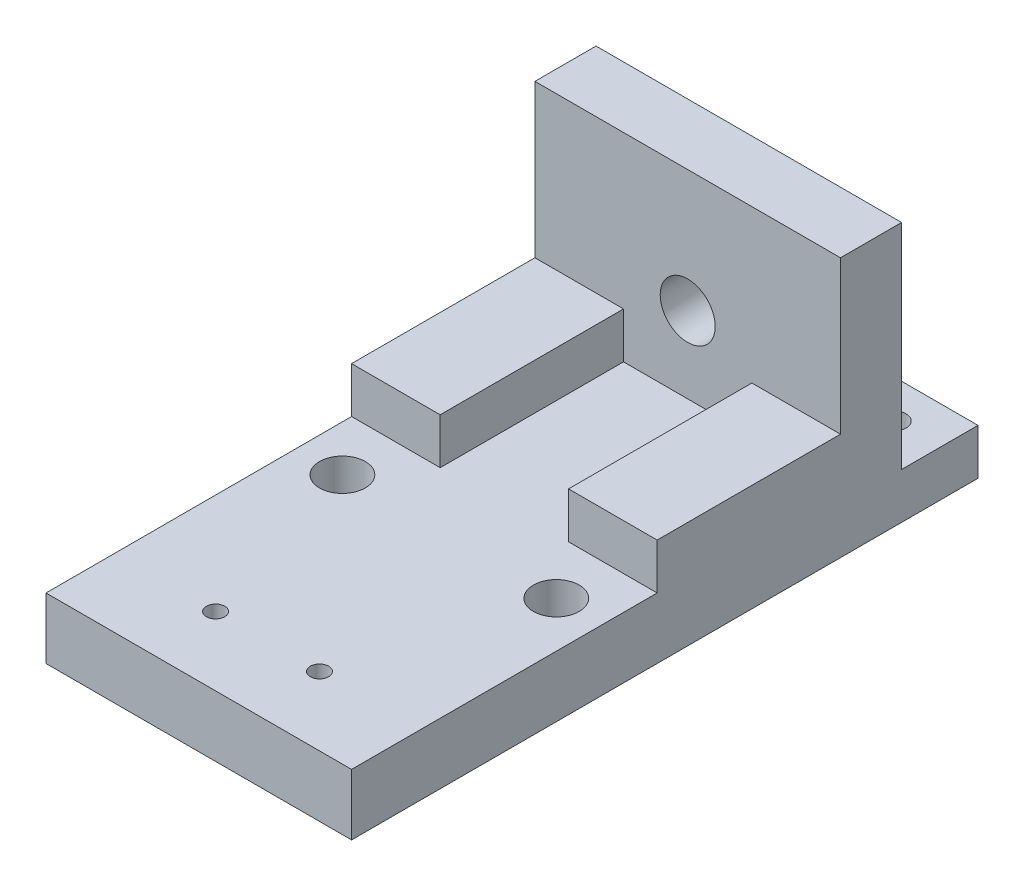
ISO-10303-21;
HEADER;
FILE_DESCRIPTION(('STEP AP214'),'2;1');
FILE_NAME('part.step','',(''),(''),'','','');
FILE_SCHEMA(('AUTOMOTIVE_DESIGN { 1 0 10303 214 1 1 1 1 }'));
ENDSEC;
DATA;
#1=APPLICATION_CONTEXT('core data for automotive mechanical design processes');
#2=APPLICATION_PROTOCOL_DEFINITION('international standard','automotive_design',2000,#1);
#3=PRODUCT_CONTEXT('',#1,'mechanical');
#4=PRODUCT('Part','Part','',(#3));
#5=PRODUCT_RELATED_PRODUCT_CATEGORY('part','',(#4));
#6=PRODUCT_DEFINITION_FORMATION('','',#4);
#7=PRODUCT_DEFINITION_CONTEXT('part definition',#1,'design');
#8=PRODUCT_DEFINITION('design','',#6,#7);
#9=PRODUCT_DEFINITION_SHAPE('','',#8);
#10=(LENGTH_UNIT() NAMED_UNIT(*) SI_UNIT(.MILLI.,.METRE.));
#11=(NAMED_UNIT(*) PLANE_ANGLE_UNIT() SI_UNIT($,.RADIAN.));
#12=(NAMED_UNIT(*) SI_UNIT($,.STERADIAN.) SOLID_ANGLE_UNIT());
#13=UNCERTAINTY_MEASURE_WITH_UNIT(LENGTH_MEASURE(1.E-05),#10,'distance_accuracy_value','');
#14=(GEOMETRIC_REPRESENTATION_CONTEXT(3) GLOBAL_UNCERTAINTY_ASSIGNED_CONTEXT((#13)) GLOBAL_UNIT_ASSIGNED_CONTEXT((#10,
#11,#12)) REPRESENTATION_CONTEXT('',''));
#15=CARTESIAN_POINT('',(0.,0.,0.));
#16=DIRECTION('',(0.,0.,1.));
#17=DIRECTION('',(1.,0.,0.));
#18=AXIS2_PLACEMENT_3D('',#15,#16,#17);
#19=CARTESIAN_POINT('',(100.,41.7474809536514,-32.3671251270142));
#20=DIRECTION('',(0.,-1.,0.));
#21=DIRECTION('',(0.,0.,-1.));
#22=AXIS2_PLACEMENT_3D('',#19,#20,#21);
#23=PLANE('',#22);
#24=DIRECTION('',(-1.,0.,0.));
#25=VECTOR('',#24,1.);
#26=CARTESIAN_POINT('',(100.,41.7474809536514,27.6328748729858));
#27=LINE('',#26,#25);
#28=CARTESIAN_POINT('',(29.,41.7474809536514,27.6328748729858));
#29=VERTEX_POINT('',#28);
#30=CARTESIAN_POINT('',(0.,41.7474809536514,27.6328748729858));
#31=VERTEX_POINT('',#30);
#32=EDGE_CURVE('E214',#29,#31,#27,.T.);
#33=ORIENTED_EDGE('',*,*,#32,.F.);
#34=DIRECTION('',(0.,0.,1.));
#35=VECTOR('',#34,1.);
#36=CARTESIAN_POINT('',(29.,41.7474809536514,-32.3671251270142));
#37=LINE('',#36,#35);
#38=CARTESIAN_POINT('',(29.,41.7474809536514,-32.3671251270142));
#39=VERTEX_POINT('',#38);
#40=EDGE_CURVE('E245',#39,#29,#37,.T.);
#41=ORIENTED_EDGE('',*,*,#40,.F.);
#42=DIRECTION('',(-1.,0.,0.));
#43=VECTOR('',#42,1.);
#44=CARTESIAN_POINT('',(100.,41.7474809536514,-32.3671251270142));
#45=LINE('',#44,#43);
#46=CARTESIAN_POINT('',(0.,41.7474809536514,-32.3671251270142));
#47=VERTEX_POINT('',#46);
#48=EDGE_CURVE('E166',#39,#47,#45,.T.);
#49=ORIENTED_EDGE('',*,*,#48,.T.);
#50=DIRECTION('',(0.,0.,1.));
#51=VECTOR('',#50,1.);
#52=CARTESIAN_POINT('',(0.,41.7474809536514,-32.3671251270142));
#53=LINE('',#52,#51);
#54=EDGE_CURVE('E202',#47,#31,#53,.T.);
#55=ORIENTED_EDGE('',*,*,#54,.T.);
#56=EDGE_LOOP('',(#33,#41,#49,#55));
#57=FACE_BOUND('',#56,.T.);
#58=ADVANCED_FACE('F45',(#57),#23,.F.);
#59=CARTESIAN_POINT('',(100.,41.7474809536514,27.6328748729858));
#60=DIRECTION('',(0.,0.,-1.));
#61=DIRECTION('',(0.,1.,0.));
#62=AXIS2_PLACEMENT_3D('',#59,#60,#61);
#63=PLANE('',#62);
#64=DIRECTION('',(-1.,0.,0.));
#65=VECTOR('',#64,1.);
#66=CARTESIAN_POINT('',(100.,26.7474809536514,27.6328748729858));
#67=LINE('',#66,#65);
#68=CARTESIAN_POINT('',(29.,26.7474809536514,27.6328748729858));
#69=VERTEX_POINT('',#68);
#70=CARTESIAN_POINT('',(0.,26.7474809536514,27.6328748729858));
#71=VERTEX_POINT('',#70);
#72=EDGE_CURVE('E109',#69,#71,#67,.T.);
#73=ORIENTED_EDGE('',*,*,#72,.F.);
#74=DIRECTION('',(0.,1.,0.));
#75=VECTOR('',#74,1.);
#76=CARTESIAN_POINT('',(29.,26.7474809536514,27.6328748729858));
#77=LINE('',#76,#75);
#78=EDGE_CURVE('E271',#69,#29,#77,.T.);
#79=ORIENTED_EDGE('',*,*,#78,.T.);
#80=ORIENTED_EDGE('',*,*,#32,.T.);
#81=DIRECTION('',(0.,-1.,0.));
#82=VECTOR('',#81,1.);
#83=CARTESIAN_POINT('',(0.,41.7474809536514,27.6328748729858));
#84=LINE('',#83,#82);
#85=EDGE_CURVE('E206',#31,#71,#84,.T.);
#86=ORIENTED_EDGE('',*,*,#85,.T.);
#87=EDGE_LOOP('',(#73,#79,#80,#86));
#88=FACE_BOUND('',#87,.T.);
#89=ADVANCED_FACE('F358',(#88),#63,.F.);
#90=CARTESIAN_POINT('',(100.,26.7474809536514,27.6328748729858));
#91=DIRECTION('',(0.,-1.,0.));
#92=DIRECTION('',(0.,0.,-1.));
#93=AXIS2_PLACEMENT_3D('',#90,#91,#92);
#94=PLANE('',#93);
#95=CARTESIAN_POINT('',(85.,26.7474809536514,45.6328748729858));
#96=DIRECTION('',(0.,1.,0.));
#97=DIRECTION('',(0.,0.,1.));
#98=AXIS2_PLACEMENT_3D('',#95,#96,#97);
#99=CIRCLE('',#98,7.50000000000001);
#100=CARTESIAN_POINT('',(85.,26.7474809536514,53.1328748729858));
#101=VERTEX_POINT('',#100);
#102=EDGE_CURVE('E329',#101,#101,#99,.T.);
#103=ORIENTED_EDGE('',*,*,#102,.F.);
#104=EDGE_LOOP('',(#103));
#105=FACE_BOUND('',#104,.T.);
#106=CARTESIAN_POINT('',(15.,26.7474809536514,45.6328748729858));
#107=DIRECTION('',(0.,1.,0.));
#108=DIRECTION('',(0.,0.,1.));
#109=AXIS2_PLACEMENT_3D('',#106,#107,#108);
#110=CIRCLE('',#109,7.5);
#111=CARTESIAN_POINT('',(15.,26.7474809536514,53.1328748729858));
#112=VERTEX_POINT('',#111);
#113=EDGE_CURVE('E325',#112,#112,#110,.T.);
#114=ORIENTED_EDGE('',*,*,#113,.F.);
#115=EDGE_LOOP('',(#114));
#116=FACE_BOUND('',#115,.T.);
#117=CARTESIAN_POINT('',(67.,26.7474809536514,105.132874872986));
#118=DIRECTION('',(0.,1.,0.));
#119=DIRECTION('',(0.,0.,1.));
#120=AXIS2_PLACEMENT_3D('',#117,#118,#119);
#121=CIRCLE('',#120,3.00000000000001);
#122=CARTESIAN_POINT('',(67.,26.7474809536514,108.132874872986));
#123=VERTEX_POINT('',#122);
#124=EDGE_CURVE('E302',#123,#123,#121,.T.);
#125=ORIENTED_EDGE('',*,*,#124,.F.);
#126=EDGE_LOOP('',(#125));
#127=FACE_BOUND('',#126,.T.);
#128=CARTESIAN_POINT('',(33.,26.7474809536514,105.132874872986));
#129=DIRECTION('',(0.,1.,0.));
#130=DIRECTION('',(0.,0.,1.));
#131=AXIS2_PLACEMENT_3D('',#128,#129,#130);
#132=CIRCLE('',#131,3.);
#133=CARTESIAN_POINT('',(33.,26.7474809536514,108.132874872986));
#134=VERTEX_POINT('',#133);
#135=EDGE_CURVE('E301',#134,#134,#132,.T.);
#136=ORIENTED_EDGE('',*,*,#135,.F.);
#137=EDGE_LOOP('',(#136));
#138=FACE_BOUND('',#137,.T.);
#139=DIRECTION('',(0.,0.,1.));
#140=VECTOR('',#139,1.);
#141=CARTESIAN_POINT('',(0.,26.7474809536514,27.6328748729858));
#142=LINE('',#141,#140);
#143=CARTESIAN_POINT('',(0.,26.7474809536514,127.632874872986));
#144=VERTEX_POINT('',#143);
#145=EDGE_CURVE('E177',#71,#144,#142,.T.);
#146=ORIENTED_EDGE('',*,*,#145,.T.);
#147=DIRECTION('',(-1.,0.,0.));
#148=VECTOR('',#147,1.);
#149=CARTESIAN_POINT('',(100.,26.7474809536514,127.632874872986));
#150=LINE('',#149,#148);
#151=CARTESIAN_POINT('',(100.,26.7474809536514,127.632874872986));
#152=VERTEX_POINT('',#151);
#153=EDGE_CURVE('E11',#152,#144,#150,.T.);
#154=ORIENTED_EDGE('',*,*,#153,.F.);
#155=DIRECTION('',(0.,0.,1.));
#156=VECTOR('',#155,1.);
#157=CARTESIAN_POINT('',(100.,26.7474809536514,27.6328748729858));
#158=LINE('',#157,#156);
#159=CARTESIAN_POINT('',(100.,26.7474809536514,27.6328748729858));
#160=VERTEX_POINT('',#159);
#161=EDGE_CURVE('E209',#160,#152,#158,.T.);
#162=ORIENTED_EDGE('',*,*,#161,.F.);
#163=CARTESIAN_POINT('',(71.,26.7474809536514,27.6328748729858));
#164=VERTEX_POINT('',#163);
#165=EDGE_CURVE('E210',#160,#164,#67,.T.);
#166=ORIENTED_EDGE('',*,*,#165,.T.);
#167=DIRECTION('',(0.,0.,-1.));
#168=VECTOR('',#167,1.);
#169=CARTESIAN_POINT('',(71.,26.7474809536514,-32.3671251270142));
#170=LINE('',#169,#168);
#171=CARTESIAN_POINT('',(71.,26.7474809536514,-32.3671251270142));
#172=VERTEX_POINT('',#171);
#173=EDGE_CURVE('E292',#164,#172,#170,.T.);
#174=ORIENTED_EDGE('',*,*,#173,.T.);
#175=DIRECTION('',(-1.,0.,0.));
#176=VECTOR('',#175,1.);
#177=CARTESIAN_POINT('',(29.,26.7474809536514,-32.3671251270142));
#178=LINE('',#177,#176);
#179=CARTESIAN_POINT('',(29.,26.7474809536514,-32.3671251270142));
#180=VERTEX_POINT('',#179);
#181=EDGE_CURVE('E260',#172,#180,#178,.T.);
#182=ORIENTED_EDGE('',*,*,#181,.T.);
#183=DIRECTION('',(0.,0.,1.));
#184=VECTOR('',#183,1.);
#185=CARTESIAN_POINT('',(29.,26.7474809536514,-32.3671251270142));
#186=LINE('',#185,#184);
#187=EDGE_CURVE('E63',#180,#69,#186,.T.);
#188=ORIENTED_EDGE('',*,*,#187,.T.);
#189=ORIENTED_EDGE('',*,*,#72,.T.);
#190=EDGE_LOOP('',(#146,#154,#162,#166,#174,#182,#188,#189));
#191=FACE_BOUND('',#190,.T.);
#192=ADVANCED_FACE('F47',(#105,#116,#127,#138,#191),#94,.F.);
#193=CARTESIAN_POINT('',(100.,26.7474809536514,127.632874872986));
#194=DIRECTION('',(0.,0.,-1.));
#195=DIRECTION('',(-1.,0.,0.));
#196=AXIS2_PLACEMENT_3D('',#193,#194,#195);
#197=PLANE('',#196);
#198=DIRECTION('',(0.,-1.,0.));
#199=VECTOR('',#198,1.);
#200=CARTESIAN_POINT('',(0.,26.7474809536514,127.632874872986));
#201=LINE('',#200,#199);
#202=CARTESIAN_POINT('',(0.,6.74748095365137,127.632874872986));
#203=VERTEX_POINT('',#202);
#204=EDGE_CURVE('E180',#144,#203,#201,.T.);
#205=ORIENTED_EDGE('',*,*,#204,.T.);
#206=DIRECTION('',(-1.,0.,0.));
#207=VECTOR('',#206,1.);
#208=CARTESIAN_POINT('',(100.,6.74748095365137,127.632874872986));
#209=LINE('',#208,#207);
#210=CARTESIAN_POINT('',(100.,6.74748095365137,127.632874872986));
#211=VERTEX_POINT('',#210);
#212=EDGE_CURVE('E55',#211,#203,#209,.T.);
#213=ORIENTED_EDGE('',*,*,#212,.F.);
#214=DIRECTION('',(0.,-1.,0.));
#215=VECTOR('',#214,1.);
#216=CARTESIAN_POINT('',(100.,26.7474809536514,127.632874872986));
#217=LINE('',#216,#215);
#218=EDGE_CURVE('E117',#152,#211,#217,.T.);
#219=ORIENTED_EDGE('',*,*,#218,.F.);
#220=ORIENTED_EDGE('',*,*,#153,.T.);
#221=EDGE_LOOP('',(#205,#213,#219,#220));
#222=FACE_BOUND('',#221,.T.);
#223=ADVANCED_FACE('F395',(#222),#197,.F.);
#224=CARTESIAN_POINT('',(100.,6.74748095365137,127.632874872986));
#225=DIRECTION('',(0.,1.,0.));
#226=DIRECTION('',(0.,0.,1.));
#227=AXIS2_PLACEMENT_3D('',#224,#225,#226);
#228=PLANE('',#227);
#229=CARTESIAN_POINT('',(85.,6.74748095365135,45.6328748729858));
#230=DIRECTION('',(0.,1.,0.));
#231=DIRECTION('',(0.,0.,1.));
#232=AXIS2_PLACEMENT_3D('',#229,#230,#231);
#233=CIRCLE('',#232,7.50000000000001);
#234=CARTESIAN_POINT('',(85.,6.74748095365135,53.1328748729858));
#235=VERTEX_POINT('',#234);
#236=EDGE_CURVE('E314',#235,#235,#233,.T.);
#237=ORIENTED_EDGE('',*,*,#236,.T.);
#238=EDGE_LOOP('',(#237));
#239=FACE_BOUND('',#238,.T.);
#240=CARTESIAN_POINT('',(15.,6.74748095365135,45.6328748729858));
#241=DIRECTION('',(0.,1.,0.));
#242=DIRECTION('',(0.,0.,1.));
#243=AXIS2_PLACEMENT_3D('',#240,#241,#242);
#244=CIRCLE('',#243,7.5);
#245=CARTESIAN_POINT('',(15.,6.74748095365135,53.1328748729858));
#246=VERTEX_POINT('',#245);
#247=EDGE_CURVE('E321',#246,#246,#244,.T.);
#248=ORIENTED_EDGE('',*,*,#247,.T.);
#249=EDGE_LOOP('',(#248));
#250=FACE_BOUND('',#249,.T.);
#251=CARTESIAN_POINT('',(15.,6.74748095365137,-64.8671251270142));
#252=DIRECTION('',(0.,1.,0.));
#253=DIRECTION('',(0.,0.,1.));
#254=AXIS2_PLACEMENT_3D('',#251,#252,#253);
#255=CIRCLE('',#254,4.);
#256=CARTESIAN_POINT('',(15.,6.74748095365137,-60.8671251270142));
#257=VERTEX_POINT('',#256);
#258=EDGE_CURVE('E242',#257,#257,#255,.T.);
#259=ORIENTED_EDGE('',*,*,#258,.T.);
#260=EDGE_LOOP('',(#259));
#261=FACE_BOUND('',#260,.T.);
#262=CARTESIAN_POINT('',(67.,6.74748095365136,105.132874872986));
#263=DIRECTION('',(0.,1.,0.));
#264=DIRECTION('',(0.,0.,1.));
#265=AXIS2_PLACEMENT_3D('',#262,#263,#264);
#266=CIRCLE('',#265,3.00000000000001);
#267=CARTESIAN_POINT('',(67.,6.74748095365136,108.132874872986));
#268=VERTEX_POINT('',#267);
#269=EDGE_CURVE('E310',#268,#268,#266,.T.);
#270=ORIENTED_EDGE('',*,*,#269,.T.);
#271=EDGE_LOOP('',(#270));
#272=FACE_BOUND('',#271,.T.);
#273=CARTESIAN_POINT('',(33.,6.74748095365136,105.132874872986));
#274=DIRECTION('',(0.,1.,0.));
#275=DIRECTION('',(0.,0.,1.));
#276=AXIS2_PLACEMENT_3D('',#273,#274,#275);
#277=CIRCLE('',#276,3.);
#278=CARTESIAN_POINT('',(33.,6.74748095365136,108.132874872986));
#279=VERTEX_POINT('',#278);
#280=EDGE_CURVE('E297',#279,#279,#277,.T.);
#281=ORIENTED_EDGE('',*,*,#280,.T.);
#282=EDGE_LOOP('',(#281));
#283=FACE_BOUND('',#282,.T.);
#284=CARTESIAN_POINT('',(85.,6.74748095365137,-64.8671251270142));
#285=DIRECTION('',(0.,1.,0.));
#286=DIRECTION('',(0.,0.,1.));
#287=AXIS2_PLACEMENT_3D('',#284,#285,#286);
#288=CIRCLE('',#287,4.00000000000001);
#289=CARTESIAN_POINT('',(85.,6.74748095365137,-60.8671251270142));
#290=VERTEX_POINT('',#289);
#291=EDGE_CURVE('E306',#290,#290,#288,.T.);
#292=ORIENTED_EDGE('',*,*,#291,.T.);
#293=EDGE_LOOP('',(#292));
#294=FACE_BOUND('',#293,.T.);
#295=DIRECTION('',(0.,0.,-1.));
#296=VECTOR('',#295,1.);
#297=CARTESIAN_POINT('',(0.,6.74748095365137,127.632874872986));
#298=LINE('',#297,#296);
#299=CARTESIAN_POINT('',(0.,6.74748095365137,-77.3671251270142));
#300=VERTEX_POINT('',#299);
#301=EDGE_CURVE('E184',#203,#300,#298,.T.);
#302=ORIENTED_EDGE('',*,*,#301,.T.);
#303=DIRECTION('',(-1.,0.,0.));
#304=VECTOR('',#303,1.);
#305=CARTESIAN_POINT('',(100.,6.74748095365137,-77.3671251270142));
#306=LINE('',#305,#304);
#307=CARTESIAN_POINT('',(100.,6.74748095365137,-77.3671251270142));
#308=VERTEX_POINT('',#307);
#309=EDGE_CURVE('E231',#308,#300,#306,.T.);
#310=ORIENTED_EDGE('',*,*,#309,.F.);
#311=DIRECTION('',(0.,0.,-1.));
#312=VECTOR('',#311,1.);
#313=CARTESIAN_POINT('',(100.,6.74748095365137,127.632874872986));
#314=LINE('',#313,#312);
#315=EDGE_CURVE('E278',#211,#308,#314,.T.);
#316=ORIENTED_EDGE('',*,*,#315,.F.);
#317=ORIENTED_EDGE('',*,*,#212,.T.);
#318=EDGE_LOOP('',(#302,#310,#316,#317));
#319=FACE_BOUND('',#318,.T.);
#320=ADVANCED_FACE('F392',(#239,#250,#261,#272,#283,#294,#319),#228,.F.);
#321=CARTESIAN_POINT('',(100.,6.74748095365137,-77.3671251270142));
#322=DIRECTION('',(0.,0.,1.));
#323=DIRECTION('',(1.,0.,0.));
#324=AXIS2_PLACEMENT_3D('',#321,#322,#323);
#325=PLANE('',#324);
#326=DIRECTION('',(0.,1.,0.));
#327=VECTOR('',#326,1.);
#328=CARTESIAN_POINT('',(0.,6.74748095365137,-77.3671251270142));
#329=LINE('',#328,#327);
#330=CARTESIAN_POINT('',(0.,21.7474809536514,-77.3671251270142));
#331=VERTEX_POINT('',#330);
#332=EDGE_CURVE('E187',#300,#331,#329,.T.);
#333=ORIENTED_EDGE('',*,*,#332,.T.);
#334=DIRECTION('',(-1.,0.,0.));
#335=VECTOR('',#334,1.);
#336=CARTESIAN_POINT('',(100.,21.7474809536514,-77.3671251270142));
#337=LINE('',#336,#335);
#338=CARTESIAN_POINT('',(100.,21.7474809536514,-77.3671251270142));
#339=VERTEX_POINT('',#338);
#340=EDGE_CURVE('E227',#339,#331,#337,.T.);
#341=ORIENTED_EDGE('',*,*,#340,.F.);
#342=DIRECTION('',(0.,1.,0.));
#343=VECTOR('',#342,1.);
#344=CARTESIAN_POINT('',(100.,6.74748095365137,-77.3671251270142));
#345=LINE('',#344,#343);
#346=EDGE_CURVE('E281',#308,#339,#345,.T.);
#347=ORIENTED_EDGE('',*,*,#346,.F.);
#348=ORIENTED_EDGE('',*,*,#309,.T.);
#349=EDGE_LOOP('',(#333,#341,#347,#348));
#350=FACE_BOUND('',#349,.T.);
#351=ADVANCED_FACE('F389',(#350),#325,.F.);
#352=CARTESIAN_POINT('',(100.,21.7474809536514,-77.3671251270142));
#353=DIRECTION('',(0.,-1.,0.));
#354=DIRECTION('',(0.,0.,-1.));
#355=AXIS2_PLACEMENT_3D('',#352,#353,#354);
#356=PLANE('',#355);
#357=CARTESIAN_POINT('',(15.,21.7474809536514,-64.8671251270142));
#358=DIRECTION('',(0.,-1.,0.));
#359=DIRECTION('',(0.,0.,-1.));
#360=AXIS2_PLACEMENT_3D('',#357,#358,#359);
#361=CIRCLE('',#360,4.);
#362=CARTESIAN_POINT('',(15.,21.7474809536514,-68.8671251270142));
#363=VERTEX_POINT('',#362);
#364=EDGE_CURVE('E241',#363,#363,#361,.T.);
#365=ORIENTED_EDGE('',*,*,#364,.T.);
#366=EDGE_LOOP('',(#365));
#367=FACE_BOUND('',#366,.T.);
#368=CARTESIAN_POINT('',(85.,21.7474809536514,-64.8671251270142));
#369=DIRECTION('',(0.,-1.,0.));
#370=DIRECTION('',(0.,0.,-1.));
#371=AXIS2_PLACEMENT_3D('',#368,#369,#370);
#372=CIRCLE('',#371,4.00000000000001);
#373=CARTESIAN_POINT('',(85.,21.7474809536514,-68.8671251270142));
#374=VERTEX_POINT('',#373);
#375=EDGE_CURVE('E238',#374,#374,#372,.T.);
#376=ORIENTED_EDGE('',*,*,#375,.T.);
#377=EDGE_LOOP('',(#376));
#378=FACE_BOUND('',#377,.T.);
#379=DIRECTION('',(0.,0.,1.));
#380=VECTOR('',#379,1.);
#381=CARTESIAN_POINT('',(0.,21.7474809536514,-77.3671251270142));
#382=LINE('',#381,#380);
#383=CARTESIAN_POINT('',(0.,21.7474809536514,-52.3671251270142));
#384=VERTEX_POINT('',#383);
#385=EDGE_CURVE('E190',#331,#384,#382,.T.);
#386=ORIENTED_EDGE('',*,*,#385,.T.);
#387=DIRECTION('',(-1.,0.,0.));
#388=VECTOR('',#387,1.);
#389=CARTESIAN_POINT('',(100.,21.7474809536514,-52.3671251270142));
#390=LINE('',#389,#388);
#391=CARTESIAN_POINT('',(100.,21.7474809536514,-52.3671251270142));
#392=VERTEX_POINT('',#391);
#393=EDGE_CURVE('E223',#392,#384,#390,.T.);
#394=ORIENTED_EDGE('',*,*,#393,.F.);
#395=DIRECTION('',(0.,0.,1.));
#396=VECTOR('',#395,1.);
#397=CARTESIAN_POINT('',(100.,21.7474809536514,-77.3671251270142));
#398=LINE('',#397,#396);
#399=EDGE_CURVE('E284',#339,#392,#398,.T.);
#400=ORIENTED_EDGE('',*,*,#399,.F.);
#401=ORIENTED_EDGE('',*,*,#340,.T.);
#402=EDGE_LOOP('',(#386,#394,#400,#401));
#403=FACE_BOUND('',#402,.T.);
#404=ADVANCED_FACE('F385',(#367,#378,#403),#356,.F.);
#405=CARTESIAN_POINT('',(100.,21.7474809536514,-52.3671251270142));
#406=DIRECTION('',(0.,0.,1.));
#407=DIRECTION('',(1.,0.,0.));
#408=AXIS2_PLACEMENT_3D('',#405,#406,#407);
#409=PLANE('',#408);
#410=CARTESIAN_POINT('',(50.,51.7474809536514,-52.3671251270142));
#411=DIRECTION('',(0.,0.,-1.));
#412=DIRECTION('',(-1.,0.,0.));
#413=AXIS2_PLACEMENT_3D('',#410,#411,#412);
#414=CIRCLE('',#413,9.);
#415=CARTESIAN_POINT('',(41.,51.7474809536514,-52.3671251270142));
#416=VERTEX_POINT('',#415);
#417=EDGE_CURVE('E336',#416,#416,#414,.T.);
#418=ORIENTED_EDGE('',*,*,#417,.F.);
#419=EDGE_LOOP('',(#418));
#420=FACE_BOUND('',#419,.T.);
#421=DIRECTION('',(0.,1.,0.));
#422=VECTOR('',#421,1.);
#423=CARTESIAN_POINT('',(0.,21.7474809536514,-52.3671251270142));
#424=LINE('',#423,#422);
#425=CARTESIAN_POINT('',(0.,91.7474809536514,-52.3671251270142));
#426=VERTEX_POINT('',#425);
#427=EDGE_CURVE('E193',#384,#426,#424,.T.);
#428=ORIENTED_EDGE('',*,*,#427,.T.);
#429=DIRECTION('',(-1.,0.,0.));
#430=VECTOR('',#429,1.);
#431=CARTESIAN_POINT('',(100.,91.7474809536514,-52.3671251270142));
#432=LINE('',#431,#430);
#433=CARTESIAN_POINT('',(100.,91.7474809536514,-52.3671251270142));
#434=VERTEX_POINT('',#433);
#435=EDGE_CURVE('E219',#434,#426,#432,.T.);
#436=ORIENTED_EDGE('',*,*,#435,.F.);
#437=DIRECTION('',(0.,1.,0.));
#438=VECTOR('',#437,1.);
#439=CARTESIAN_POINT('',(100.,21.7474809536514,-52.3671251270142));
#440=LINE('',#439,#438);
#441=EDGE_CURVE('E287',#392,#434,#440,.T.);
#442=ORIENTED_EDGE('',*,*,#441,.F.);
#443=ORIENTED_EDGE('',*,*,#393,.T.);
#444=EDGE_LOOP('',(#428,#436,#442,#443));
#445=FACE_BOUND('',#444,.T.);
#446=ADVANCED_FACE('F380',(#420,#445),#409,.F.);
#447=CARTESIAN_POINT('',(100.,91.7474809536514,-52.3671251270142));
#448=DIRECTION('',(0.,-1.,0.));
#449=DIRECTION('',(0.,0.,-1.));
#450=AXIS2_PLACEMENT_3D('',#447,#448,#449);
#451=PLANE('',#450);
#452=DIRECTION('',(0.,0.,1.));
#453=VECTOR('',#452,1.);
#454=CARTESIAN_POINT('',(0.,91.7474809536514,-52.3671251270142));
#455=LINE('',#454,#453);
#456=CARTESIAN_POINT('',(0.,91.7474809536514,-32.3671251270142));
#457=VERTEX_POINT('',#456);
#458=EDGE_CURVE('E196',#426,#457,#455,.T.);
#459=ORIENTED_EDGE('',*,*,#458,.T.);
#460=DIRECTION('',(-1.,0.,0.));
#461=VECTOR('',#460,1.);
#462=CARTESIAN_POINT('',(100.,91.7474809536514,-32.3671251270142));
#463=LINE('',#462,#461);
#464=CARTESIAN_POINT('',(100.,91.7474809536514,-32.3671251270142));
#465=VERTEX_POINT('',#464);
#466=EDGE_CURVE('E165',#465,#457,#463,.T.);
#467=ORIENTED_EDGE('',*,*,#466,.F.);
#468=DIRECTION('',(0.,0.,1.));
#469=VECTOR('',#468,1.);
#470=CARTESIAN_POINT('',(100.,91.7474809536514,-52.3671251270142));
#471=LINE('',#470,#469);
#472=EDGE_CURVE('E146',#434,#465,#471,.T.);
#473=ORIENTED_EDGE('',*,*,#472,.F.);
#474=ORIENTED_EDGE('',*,*,#435,.T.);
#475=EDGE_LOOP('',(#459,#467,#473,#474));
#476=FACE_BOUND('',#475,.T.);
#477=ADVANCED_FACE('F375',(#476),#451,.F.);
#478=CARTESIAN_POINT('',(100.,91.7474809536514,-32.3671251270142));
#479=DIRECTION('',(0.,0.,-1.));
#480=DIRECTION('',(0.,1.,0.));
#481=AXIS2_PLACEMENT_3D('',#478,#479,#480);
#482=PLANE('',#481);
#483=CARTESIAN_POINT('',(50.,51.7474809536514,-32.3671251270142));
#484=DIRECTION('',(0.,0.,-1.));
#485=DIRECTION('',(0.,1.,0.));
#486=AXIS2_PLACEMENT_3D('',#483,#484,#485);
#487=CIRCLE('',#486,9.);
#488=CARTESIAN_POINT('',(41.,51.7474809536514,-32.3671251270142));
#489=VERTEX_POINT('',#488);
#490=EDGE_CURVE('E49',#489,#489,#487,.T.);
#491=ORIENTED_EDGE('',*,*,#490,.T.);
#492=EDGE_LOOP('',(#491));
#493=FACE_BOUND('',#492,.T.);
#494=DIRECTION('',(0.,-1.,0.));
#495=VECTOR('',#494,1.);
#496=CARTESIAN_POINT('',(0.,91.7474809536514,-32.3671251270142));
#497=LINE('',#496,#495);
#498=EDGE_CURVE('E199',#457,#47,#497,.T.);
#499=ORIENTED_EDGE('',*,*,#498,.T.);
#500=ORIENTED_EDGE('',*,*,#48,.F.);
#501=DIRECTION('',(0.,1.,0.));
#502=VECTOR('',#501,1.);
#503=CARTESIAN_POINT('',(29.,26.7474809536514,-32.3671251270142));
#504=LINE('',#503,#502);
#505=EDGE_CURVE('E181',#180,#39,#504,.T.);
#506=ORIENTED_EDGE('',*,*,#505,.F.);
#507=ORIENTED_EDGE('',*,*,#181,.F.);
#508=DIRECTION('',(0.,1.,0.));
#509=VECTOR('',#508,1.);
#510=CARTESIAN_POINT('',(71.,26.7474809536514,-32.3671251270142));
#511=LINE('',#510,#509);
#512=CARTESIAN_POINT('',(71.,41.7474809536514,-32.3671251270142));
#513=VERTEX_POINT('',#512);
#514=EDGE_CURVE('E160',#172,#513,#511,.T.);
#515=ORIENTED_EDGE('',*,*,#514,.T.);
#516=CARTESIAN_POINT('',(100.,41.7474809536514,-32.3671251270142));
#517=VERTEX_POINT('',#516);
#518=EDGE_CURVE('E154',#517,#513,#45,.T.);
#519=ORIENTED_EDGE('',*,*,#518,.F.);
#520=DIRECTION('',(0.,-1.,0.));
#521=VECTOR('',#520,1.);
#522=CARTESIAN_POINT('',(100.,91.7474809536514,-32.3671251270142));
#523=LINE('',#522,#521);
#524=EDGE_CURVE('E139',#465,#517,#523,.T.);
#525=ORIENTED_EDGE('',*,*,#524,.F.);
#526=ORIENTED_EDGE('',*,*,#466,.T.);
#527=EDGE_LOOP('',(#499,#500,#506,#507,#515,#519,#525,#526));
#528=FACE_BOUND('',#527,.T.);
#529=ADVANCED_FACE('F156',(#493,#528),#482,.F.);
#530=ORIENTED_EDGE('',*,*,#518,.T.);
#531=DIRECTION('',(0.,0.,-1.));
#532=VECTOR('',#531,1.);
#533=CARTESIAN_POINT('',(71.,41.7474809536514,-32.3671251270142));
#534=LINE('',#533,#532);
#535=CARTESIAN_POINT('',(71.,41.7474809536514,27.6328748729858));
#536=VERTEX_POINT('',#535);
#537=EDGE_CURVE('E250',#536,#513,#534,.T.);
#538=ORIENTED_EDGE('',*,*,#537,.F.);
#539=CARTESIAN_POINT('',(100.,41.7474809536514,27.6328748729858));
#540=VERTEX_POINT('',#539);
#541=EDGE_CURVE('E170',#540,#536,#27,.T.);
#542=ORIENTED_EDGE('',*,*,#541,.F.);
#543=DIRECTION('',(0.,0.,1.));
#544=VECTOR('',#543,1.);
#545=CARTESIAN_POINT('',(100.,41.7474809536514,-32.3671251270142));
#546=LINE('',#545,#544);
#547=EDGE_CURVE('E143',#517,#540,#546,.T.);
#548=ORIENTED_EDGE('',*,*,#547,.F.);
#549=EDGE_LOOP('',(#530,#538,#542,#548));
#550=FACE_BOUND('',#549,.T.);
#551=ADVANCED_FACE('F168',(#550),#23,.F.);
#552=ORIENTED_EDGE('',*,*,#541,.T.);
#553=DIRECTION('',(0.,1.,0.));
#554=VECTOR('',#553,1.);
#555=CARTESIAN_POINT('',(71.,26.7474809536514,27.6328748729858));
#556=LINE('',#555,#554);
#557=EDGE_CURVE('E267',#164,#536,#556,.T.);
#558=ORIENTED_EDGE('',*,*,#557,.F.);
#559=ORIENTED_EDGE('',*,*,#165,.F.);
#560=DIRECTION('',(0.,-1.,0.));
#561=VECTOR('',#560,1.);
#562=CARTESIAN_POINT('',(100.,41.7474809536514,27.6328748729858));
#563=LINE('',#562,#561);
#564=EDGE_CURVE('E72',#540,#160,#563,.T.);
#565=ORIENTED_EDGE('',*,*,#564,.F.);
#566=EDGE_LOOP('',(#552,#558,#559,#565));
#567=FACE_BOUND('',#566,.T.);
#568=ADVANCED_FACE('F367',(#567),#63,.F.);
#569=CARTESIAN_POINT('',(100.,0.,0.));
#570=DIRECTION('',(1.,0.,0.));
#571=DIRECTION('',(0.,0.,-1.));
#572=AXIS2_PLACEMENT_3D('',#569,#570,#571);
#573=PLANE('',#572);
#574=ORIENTED_EDGE('',*,*,#161,.T.);
#575=ORIENTED_EDGE('',*,*,#218,.T.);
#576=ORIENTED_EDGE('',*,*,#315,.T.);
#577=ORIENTED_EDGE('',*,*,#346,.T.);
#578=ORIENTED_EDGE('',*,*,#399,.T.);
#579=ORIENTED_EDGE('',*,*,#441,.T.);
#580=ORIENTED_EDGE('',*,*,#472,.T.);
#581=ORIENTED_EDGE('',*,*,#524,.T.);
#582=ORIENTED_EDGE('',*,*,#547,.T.);
#583=ORIENTED_EDGE('',*,*,#564,.T.);
#584=EDGE_LOOP('',(#574,#575,#576,#577,#578,#579,#580,#581,#582,#583));
#585=FACE_BOUND('',#584,.T.);
#586=ADVANCED_FACE('F141',(#585),#573,.T.);
#587=CARTESIAN_POINT('',(0.,0.,0.));
#588=DIRECTION('',(1.,0.,0.));
#589=DIRECTION('',(0.,0.,-1.));
#590=AXIS2_PLACEMENT_3D('',#587,#588,#589);
#591=PLANE('',#590);
#592=ORIENTED_EDGE('',*,*,#145,.F.);
#593=ORIENTED_EDGE('',*,*,#85,.F.);
#594=ORIENTED_EDGE('',*,*,#54,.F.);
#595=ORIENTED_EDGE('',*,*,#498,.F.);
#596=ORIENTED_EDGE('',*,*,#458,.F.);
#597=ORIENTED_EDGE('',*,*,#427,.F.);
#598=ORIENTED_EDGE('',*,*,#385,.F.);
#599=ORIENTED_EDGE('',*,*,#332,.F.);
#600=ORIENTED_EDGE('',*,*,#301,.F.);
#601=ORIENTED_EDGE('',*,*,#204,.F.);
#602=EDGE_LOOP('',(#592,#593,#594,#595,#596,#597,#598,#599,#600,#601));
#603=FACE_BOUND('',#602,.T.);
#604=ADVANCED_FACE('F410',(#603),#591,.F.);
#605=CARTESIAN_POINT('',(29.,26.7474809536514,-32.3671251270142));
#606=DIRECTION('',(-1.,0.,0.));
#607=DIRECTION('',(0.,0.,1.));
#608=AXIS2_PLACEMENT_3D('',#605,#606,#607);
#609=PLANE('',#608);
#610=ORIENTED_EDGE('',*,*,#40,.T.);
#611=ORIENTED_EDGE('',*,*,#78,.F.);
#612=ORIENTED_EDGE('',*,*,#187,.F.);
#613=ORIENTED_EDGE('',*,*,#505,.T.);
#614=EDGE_LOOP('',(#610,#611,#612,#613));
#615=FACE_BOUND('',#614,.T.);
#616=ADVANCED_FACE('F445',(#615),#609,.F.);
#617=CARTESIAN_POINT('',(71.,26.7474809536514,-32.3671251270142));
#618=DIRECTION('',(1.,0.,0.));
#619=DIRECTION('',(0.,0.,-1.));
#620=AXIS2_PLACEMENT_3D('',#617,#618,#619);
#621=PLANE('',#620);
#622=ORIENTED_EDGE('',*,*,#537,.T.);
#623=ORIENTED_EDGE('',*,*,#514,.F.);
#624=ORIENTED_EDGE('',*,*,#173,.F.);
#625=ORIENTED_EDGE('',*,*,#557,.T.);
#626=EDGE_LOOP('',(#622,#623,#624,#625));
#627=FACE_BOUND('',#626,.T.);
#628=ADVANCED_FACE('F441',(#627),#621,.F.);
#629=CARTESIAN_POINT('',(85.,6.74748095365137,-64.8671251270142));
#630=DIRECTION('',(0.,1.,0.));
#631=DIRECTION('',(0.,0.,1.));
#632=AXIS2_PLACEMENT_3D('',#629,#630,#631);
#633=CYLINDRICAL_SURFACE('',#632,4.00000000000001);
#634=ORIENTED_EDGE('',*,*,#291,.F.);
#635=EDGE_LOOP('',(#634));
#636=FACE_BOUND('',#635,.T.);
#637=ORIENTED_EDGE('',*,*,#375,.F.);
#638=EDGE_LOOP('',(#637));
#639=FACE_BOUND('',#638,.T.);
#640=ADVANCED_FACE('F444',(#636,#639),#633,.F.);
#641=CARTESIAN_POINT('',(15.,6.74748095365137,-64.8671251270142));
#642=DIRECTION('',(0.,1.,0.));
#643=DIRECTION('',(0.,0.,1.));
#644=AXIS2_PLACEMENT_3D('',#641,#642,#643);
#645=CYLINDRICAL_SURFACE('',#644,4.);
#646=ORIENTED_EDGE('',*,*,#258,.F.);
#647=EDGE_LOOP('',(#646));
#648=FACE_BOUND('',#647,.T.);
#649=ORIENTED_EDGE('',*,*,#364,.F.);
#650=EDGE_LOOP('',(#649));
#651=FACE_BOUND('',#650,.T.);
#652=ADVANCED_FACE('F451',(#648,#651),#645,.F.);
#653=CARTESIAN_POINT('',(33.,6.74748095365136,105.132874872986));
#654=DIRECTION('',(0.,1.,0.));
#655=DIRECTION('',(0.,0.,1.));
#656=AXIS2_PLACEMENT_3D('',#653,#654,#655);
#657=CYLINDRICAL_SURFACE('',#656,3.);
#658=ORIENTED_EDGE('',*,*,#280,.F.);
#659=EDGE_LOOP('',(#658));
#660=FACE_BOUND('',#659,.T.);
#661=ORIENTED_EDGE('',*,*,#135,.T.);
#662=EDGE_LOOP('',(#661));
#663=FACE_BOUND('',#662,.T.);
#664=ADVANCED_FACE('F456',(#660,#663),#657,.F.);
#665=CARTESIAN_POINT('',(67.,6.74748095365136,105.132874872986));
#666=DIRECTION('',(0.,1.,0.));
#667=DIRECTION('',(0.,0.,1.));
#668=AXIS2_PLACEMENT_3D('',#665,#666,#667);
#669=CYLINDRICAL_SURFACE('',#668,3.00000000000001);
#670=ORIENTED_EDGE('',*,*,#269,.F.);
#671=EDGE_LOOP('',(#670));
#672=FACE_BOUND('',#671,.T.);
#673=ORIENTED_EDGE('',*,*,#124,.T.);
#674=EDGE_LOOP('',(#673));
#675=FACE_BOUND('',#674,.T.);
#676=ADVANCED_FACE('F508',(#672,#675),#669,.F.);
#677=CARTESIAN_POINT('',(15.,6.74748095365135,45.6328748729858));
#678=DIRECTION('',(0.,1.,0.));
#679=DIRECTION('',(0.,0.,1.));
#680=AXIS2_PLACEMENT_3D('',#677,#678,#679);
#681=CYLINDRICAL_SURFACE('',#680,7.5);
#682=ORIENTED_EDGE('',*,*,#247,.F.);
#683=EDGE_LOOP('',(#682));
#684=FACE_BOUND('',#683,.T.);
#685=ORIENTED_EDGE('',*,*,#113,.T.);
#686=EDGE_LOOP('',(#685));
#687=FACE_BOUND('',#686,.T.);
#688=ADVANCED_FACE('F354',(#684,#687),#681,.F.);
#689=CARTESIAN_POINT('',(85.,6.74748095365135,45.6328748729858));
#690=DIRECTION('',(0.,1.,0.));
#691=DIRECTION('',(0.,0.,1.));
#692=AXIS2_PLACEMENT_3D('',#689,#690,#691);
#693=CYLINDRICAL_SURFACE('',#692,7.50000000000001);
#694=ORIENTED_EDGE('',*,*,#236,.F.);
#695=EDGE_LOOP('',(#694));
#696=FACE_BOUND('',#695,.T.);
#697=ORIENTED_EDGE('',*,*,#102,.T.);
#698=EDGE_LOOP('',(#697));
#699=FACE_BOUND('',#698,.T.);
#700=ADVANCED_FACE('F348',(#696,#699),#693,.F.);
#701=CARTESIAN_POINT('',(50.,51.7474809536514,127.632874872986));
#702=DIRECTION('',(0.,0.,-1.));
#703=DIRECTION('',(-1.,0.,0.));
#704=AXIS2_PLACEMENT_3D('',#701,#702,#703);
#705=CYLINDRICAL_SURFACE('',#704,9.);
#706=CARTESIAN_POINT('',(41.,51.7474809536514,-52.3671251270142));
#707=CARTESIAN_POINT('',(41.,51.7474809536514,-52.1587917936809));
#708=CARTESIAN_POINT('',(41.,51.7474809536514,-51.9504584603476));
#709=CARTESIAN_POINT('',(41.,51.7474809536514,-51.5337917936809));
#710=CARTESIAN_POINT('',(41.,51.7474809536514,-51.3254584603476));
#711=CARTESIAN_POINT('',(41.,51.7474809536514,-50.9087917936809));
#712=CARTESIAN_POINT('',(41.,51.7474809536514,-50.7004584603475));
#713=CARTESIAN_POINT('',(41.,51.7474809536514,-50.2837917936809));
#714=CARTESIAN_POINT('',(41.,51.7474809536514,-50.0754584603475));
#715=CARTESIAN_POINT('',(41.,51.7474809536514,-49.6587917936809));
#716=CARTESIAN_POINT('',(41.,51.7474809536514,-49.4504584603476));
#717=CARTESIAN_POINT('',(41.,51.7474809536514,-49.0337917936809));
#718=CARTESIAN_POINT('',(41.,51.7474809536514,-48.8254584603476));
#719=CARTESIAN_POINT('',(41.,51.7474809536514,-48.4087917936809));
#720=CARTESIAN_POINT('',(41.,51.7474809536514,-48.2004584603475));
#721=CARTESIAN_POINT('',(41.,51.7474809536514,-47.7837917936809));
#722=CARTESIAN_POINT('',(41.,51.7474809536514,-47.5754584603475));
#723=CARTESIAN_POINT('',(41.,51.7474809536514,-47.1587917936809));
#724=CARTESIAN_POINT('',(41.,51.7474809536514,-46.9504584603476));
#725=CARTESIAN_POINT('',(41.,51.7474809536514,-46.5337917936809));
#726=CARTESIAN_POINT('',(41.,51.7474809536514,-46.3254584603476));
#727=CARTESIAN_POINT('',(41.,51.7474809536514,-45.9087917936809));
#728=CARTESIAN_POINT('',(41.,51.7474809536514,-45.7004584603475));
#729=CARTESIAN_POINT('',(41.,51.7474809536514,-45.2837917936809));
#730=CARTESIAN_POINT('',(41.,51.7474809536514,-45.0754584603475));
#731=CARTESIAN_POINT('',(41.,51.7474809536514,-44.6587917936809));
#732=CARTESIAN_POINT('',(41.,51.7474809536514,-44.4504584603476));
#733=CARTESIAN_POINT('',(41.,51.7474809536514,-44.0337917936809));
#734=CARTESIAN_POINT('',(41.,51.7474809536514,-43.8254584603475));
#735=CARTESIAN_POINT('',(41.,51.7474809536514,-43.4087917936809));
#736=CARTESIAN_POINT('',(41.,51.7474809536514,-43.2004584603475));
#737=CARTESIAN_POINT('',(41.,51.7474809536514,-42.7837917936809));
#738=CARTESIAN_POINT('',(41.,51.7474809536514,-42.5754584603475));
#739=CARTESIAN_POINT('',(41.,51.7474809536514,-42.1587917936809));
#740=CARTESIAN_POINT('',(41.,51.7474809536514,-41.9504584603476));
#741=CARTESIAN_POINT('',(41.,51.7474809536514,-41.5337917936809));
#742=CARTESIAN_POINT('',(41.,51.7474809536514,-41.3254584603475));
#743=CARTESIAN_POINT('',(41.,51.7474809536514,-40.9087917936809));
#744=CARTESIAN_POINT('',(41.,51.7474809536514,-40.7004584603475));
#745=CARTESIAN_POINT('',(41.,51.7474809536514,-40.2837917936809));
#746=CARTESIAN_POINT('',(41.,51.7474809536514,-40.0754584603475));
#747=CARTESIAN_POINT('',(41.,51.7474809536514,-39.6587917936809));
#748=CARTESIAN_POINT('',(41.,51.7474809536514,-39.4504584603476));
#749=CARTESIAN_POINT('',(41.,51.7474809536514,-39.0337917936809));
#750=CARTESIAN_POINT('',(41.,51.7474809536514,-38.8254584603475));
#751=CARTESIAN_POINT('',(41.,51.7474809536514,-38.4087917936809));
#752=CARTESIAN_POINT('',(41.,51.7474809536514,-38.2004584603475));
#753=CARTESIAN_POINT('',(41.,51.7474809536514,-37.7837917936809));
#754=CARTESIAN_POINT('',(41.,51.7474809536514,-37.5754584603475));
#755=CARTESIAN_POINT('',(41.,51.7474809536514,-37.1587917936809));
#756=CARTESIAN_POINT('',(41.,51.7474809536514,-36.9504584603475));
#757=CARTESIAN_POINT('',(41.,51.7474809536514,-36.5337917936809));
#758=CARTESIAN_POINT('',(41.,51.7474809536514,-36.3254584603475));
#759=CARTESIAN_POINT('',(41.,51.7474809536514,-35.9087917936809));
#760=CARTESIAN_POINT('',(41.,51.7474809536514,-35.7004584603475));
#761=CARTESIAN_POINT('',(41.,51.7474809536514,-35.2837917936809));
#762=CARTESIAN_POINT('',(41.,51.7474809536514,-35.0754584603475));
#763=CARTESIAN_POINT('',(41.,51.7474809536514,-34.6587917936809));
#764=CARTESIAN_POINT('',(41.,51.7474809536514,-34.4504584603475));
#765=CARTESIAN_POINT('',(41.,51.7474809536514,-34.0337917936809));
#766=CARTESIAN_POINT('',(41.,51.7474809536514,-33.8254584603475));
#767=CARTESIAN_POINT('',(41.,51.7474809536514,-33.4087917936809));
#768=CARTESIAN_POINT('',(41.,51.7474809536514,-33.2004584603475));
#769=CARTESIAN_POINT('',(41.,51.7474809536514,-32.7837917936809));
#770=CARTESIAN_POINT('',(41.,51.7474809536514,-32.5754584603475));
#771=CARTESIAN_POINT('',(41.,51.7474809536514,-32.3671251270142));
#772=B_SPLINE_CURVE_WITH_KNOTS('',3,(#706,#707,#708,#709,#710,#711,#712,#713,#714,#715,#716,
#717,#718,#719,#720,#721,#722,#723,#724,#725,#726,#727,#728,#729,#730,#731,#732,#733,#734,#735,
#736,#737,#738,#739,#740,#741,#742,#743,#744,#745,#746,#747,#748,#749,#750,#751,#752,#753,#754,
#755,#756,#757,#758,#759,#760,#761,#762,#763,#764,#765,#766,#767,#768,#769,#770,#771),
.UNSPECIFIED.,.F.,.F.,(4,2,2,2,2,2,2,2,2,2,2,2,2,2,2,2,2,2,2,2,2,2,2,2,2,2,2,2,2,2,2,2,4),(0.,
0.624999999999987,1.25,1.87500000000002,2.5,3.12499999999999,3.75,4.37500000000002,5.,
5.62499999999999,6.25000000000001,6.87500000000002,7.50000000000001,8.12499999999999,
8.75000000000001,9.37500000000002,10.,10.625,11.25,11.875,12.5,13.125,13.75,14.375,15.,15.625,
16.25,16.875,17.5,18.125,18.75,19.375,20.),.UNSPECIFIED.);
#773=EDGE_CURVE('BSEAM346',#416,#489,#772,.T.);
#774=ORIENTED_EDGE('',*,*,#417,.T.);
#775=ORIENTED_EDGE('',*,*,#490,.F.);
#776=ORIENTED_EDGE('',*,*,#773,.T.);
#777=ORIENTED_EDGE('',*,*,#773,.F.);
#778=EDGE_LOOP('',(#774,#776,#775,#777));
#779=FACE_BOUND('',#778,.T.);
#780=ADVANCED_FACE('F346',(#779),#705,.F.);
#781=CLOSED_SHELL('',(#58,#89,#192,#223,#320,#351,#404,#446,#477,#529,#551,#568,#586,#604,#616,
#628,#640,#652,#664,#676,#688,#700,#780));
#782=MANIFOLD_SOLID_BREP('B2',#781);
#783=ADVANCED_BREP_SHAPE_REPRESENTATION('',(#18,#782),#14);
#784=SHAPE_DEFINITION_REPRESENTATION(#9,#783);
ENDSEC;
END-ISO-10303-21;
